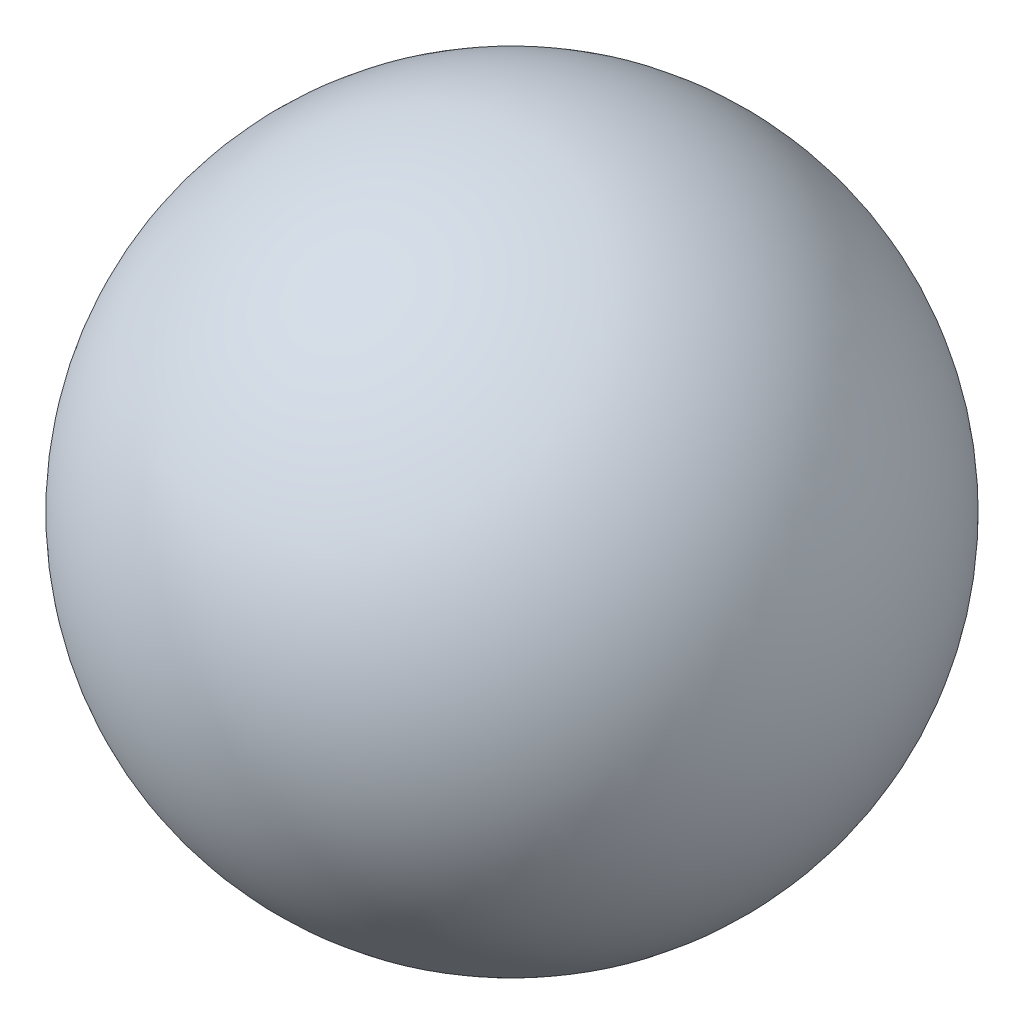
ISO-10303-21;
HEADER;
FILE_DESCRIPTION(('STEP AP214'),'2;1');
FILE_NAME('part.step','',(''),(''),'','','');
FILE_SCHEMA(('AUTOMOTIVE_DESIGN { 1 0 10303 214 1 1 1 1 }'));
ENDSEC;
DATA;
#1=APPLICATION_CONTEXT('core data for automotive mechanical design processes');
#2=APPLICATION_PROTOCOL_DEFINITION('international standard','automotive_design',2000,#1);
#3=PRODUCT_CONTEXT('',#1,'mechanical');
#4=PRODUCT('Part','Part','',(#3));
#5=PRODUCT_RELATED_PRODUCT_CATEGORY('part','',(#4));
#6=PRODUCT_DEFINITION_FORMATION('','',#4);
#7=PRODUCT_DEFINITION_CONTEXT('part definition',#1,'design');
#8=PRODUCT_DEFINITION('design','',#6,#7);
#9=PRODUCT_DEFINITION_SHAPE('','',#8);
#10=(LENGTH_UNIT() NAMED_UNIT(*) SI_UNIT(.MILLI.,.METRE.));
#11=(NAMED_UNIT(*) PLANE_ANGLE_UNIT() SI_UNIT($,.RADIAN.));
#12=(NAMED_UNIT(*) SI_UNIT($,.STERADIAN.) SOLID_ANGLE_UNIT());
#13=UNCERTAINTY_MEASURE_WITH_UNIT(LENGTH_MEASURE(1.E-05),#10,'distance_accuracy_value','');
#14=(GEOMETRIC_REPRESENTATION_CONTEXT(3) GLOBAL_UNCERTAINTY_ASSIGNED_CONTEXT((#13)) GLOBAL_UNIT_ASSIGNED_CONTEXT((#10,
#11,#12)) REPRESENTATION_CONTEXT('',''));
#15=CARTESIAN_POINT('',(0.,0.,0.));
#16=DIRECTION('',(0.,0.,1.));
#17=DIRECTION('',(1.,0.,0.));
#18=AXIS2_PLACEMENT_3D('',#15,#16,#17);
#19=CARTESIAN_POINT('',(0.,0.,0.));
#20=DIRECTION('',(0.,-1.,0.));
#21=DIRECTION('',(-1.,0.,0.));
#22=AXIS2_PLACEMENT_3D('',#19,#20,#21);
#23=SPHERICAL_SURFACE('',#22,2.75);
#24=CARTESIAN_POINT('',(0.,-2.75,0.));
#25=VERTEX_POINT('',#24);
#26=VERTEX_LOOP('',#25);
#27=FACE_BOUND('',#26,.T.);
#28=ADVANCED_FACE('F28',(#27),#23,.T.);
#29=CLOSED_SHELL('',(#28));
#30=MANIFOLD_SOLID_BREP('B2',#29);
#31=ADVANCED_BREP_SHAPE_REPRESENTATION('',(#18,#30),#14);
#32=SHAPE_DEFINITION_REPRESENTATION(#9,#31);
ENDSEC;
END-ISO-10303-21;
